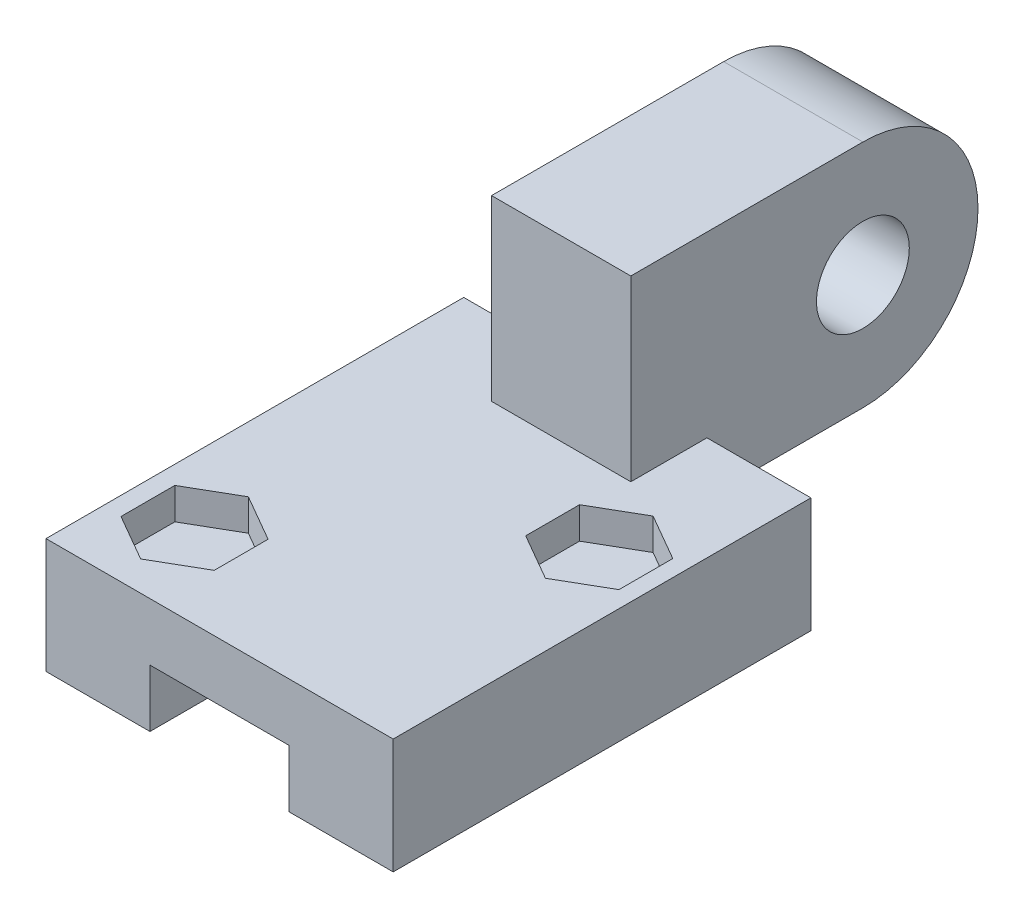
ISO-10303-21;
HEADER;
FILE_DESCRIPTION(('STEP AP214'),'2;1');
FILE_NAME('part.step','',(''),(''),'','','');
FILE_SCHEMA(('AUTOMOTIVE_DESIGN { 1 0 10303 214 1 1 1 1 }'));
ENDSEC;
DATA;
#1=APPLICATION_CONTEXT('core data for automotive mechanical design processes');
#2=APPLICATION_PROTOCOL_DEFINITION('international standard','automotive_design',2000,#1);
#3=PRODUCT_CONTEXT('',#1,'mechanical');
#4=PRODUCT('Part','Part','',(#3));
#5=PRODUCT_RELATED_PRODUCT_CATEGORY('part','',(#4));
#6=PRODUCT_DEFINITION_FORMATION('','',#4);
#7=PRODUCT_DEFINITION_CONTEXT('part definition',#1,'design');
#8=PRODUCT_DEFINITION('design','',#6,#7);
#9=PRODUCT_DEFINITION_SHAPE('','',#8);
#10=(LENGTH_UNIT() NAMED_UNIT(*) SI_UNIT(.MILLI.,.METRE.));
#11=(NAMED_UNIT(*) PLANE_ANGLE_UNIT() SI_UNIT($,.RADIAN.));
#12=(NAMED_UNIT(*) SI_UNIT($,.STERADIAN.) SOLID_ANGLE_UNIT());
#13=UNCERTAINTY_MEASURE_WITH_UNIT(LENGTH_MEASURE(1.E-05),#10,'distance_accuracy_value','');
#14=(GEOMETRIC_REPRESENTATION_CONTEXT(3) GLOBAL_UNCERTAINTY_ASSIGNED_CONTEXT((#13)) GLOBAL_UNIT_ASSIGNED_CONTEXT((#10,
#11,#12)) REPRESENTATION_CONTEXT('',''));
#15=CARTESIAN_POINT('',(0.,0.,0.));
#16=DIRECTION('',(0.,0.,1.));
#17=DIRECTION('',(1.,0.,0.));
#18=AXIS2_PLACEMENT_3D('',#15,#16,#17);
#19=CARTESIAN_POINT('',(-0.935,0.31,-2.25));
#20=DIRECTION('',(0.,1.,0.));
#21=DIRECTION('',(0.,0.,1.));
#22=AXIS2_PLACEMENT_3D('',#19,#20,#21);
#23=PLANE('',#22);
#24=DIRECTION('',(0.866025403784438,0.,0.5));
#25=VECTOR('',#24,1.);
#26=CARTESIAN_POINT('',(-0.836147367097487,0.31,-0.305));
#27=LINE('',#26,#25);
#28=CARTESIAN_POINT('',(-0.836147367097487,0.31,-0.305));
#29=VERTEX_POINT('',#28);
#30=CARTESIAN_POINT('',(-0.585,0.31,-0.159999999999999));
#31=VERTEX_POINT('',#30);
#32=EDGE_CURVE('E272',#29,#31,#27,.T.);
#33=ORIENTED_EDGE('',*,*,#32,.F.);
#34=DIRECTION('',(0.,0.,1.));
#35=VECTOR('',#34,1.);
#36=CARTESIAN_POINT('',(-0.836147367097487,0.31,-0.595));
#37=LINE('',#36,#35);
#38=CARTESIAN_POINT('',(-0.836147367097487,0.31,-0.595));
#39=VERTEX_POINT('',#38);
#40=EDGE_CURVE('E256',#39,#29,#37,.T.);
#41=ORIENTED_EDGE('',*,*,#40,.F.);
#42=DIRECTION('',(-0.866025403784439,0.,0.5));
#43=VECTOR('',#42,1.);
#44=CARTESIAN_POINT('',(-0.585,0.31,-0.74));
#45=LINE('',#44,#43);
#46=CARTESIAN_POINT('',(-0.585,0.31,-0.74));
#47=VERTEX_POINT('',#46);
#48=EDGE_CURVE('E284',#47,#39,#45,.T.);
#49=ORIENTED_EDGE('',*,*,#48,.F.);
#50=DIRECTION('',(-0.866025403784439,0.,-0.5));
#51=VECTOR('',#50,1.);
#52=CARTESIAN_POINT('',(-0.333852632902513,0.31,-0.595));
#53=LINE('',#52,#51);
#54=CARTESIAN_POINT('',(-0.333852632902513,0.31,-0.595));
#55=VERTEX_POINT('',#54);
#56=EDGE_CURVE('E281',#55,#47,#53,.T.);
#57=ORIENTED_EDGE('',*,*,#56,.F.);
#58=DIRECTION('',(0.,0.,-1.));
#59=VECTOR('',#58,1.);
#60=CARTESIAN_POINT('',(-0.333852632902513,0.31,-0.305));
#61=LINE('',#60,#59);
#62=CARTESIAN_POINT('',(-0.333852632902513,0.31,-0.305));
#63=VERTEX_POINT('',#62);
#64=EDGE_CURVE('E278',#63,#55,#61,.T.);
#65=ORIENTED_EDGE('',*,*,#64,.F.);
#66=DIRECTION('',(0.866025403784438,0.,-0.5));
#67=VECTOR('',#66,1.);
#68=CARTESIAN_POINT('',(-0.585,0.31,-0.16));
#69=LINE('',#68,#67);
#70=EDGE_CURVE('E274',#31,#63,#69,.T.);
#71=ORIENTED_EDGE('',*,*,#70,.F.);
#72=EDGE_LOOP('',(#33,#41,#49,#57,#65,#71));
#73=FACE_BOUND('',#72,.T.);
#74=DIRECTION('',(0.866025403784439,0.,0.5));
#75=VECTOR('',#74,1.);
#76=CARTESIAN_POINT('',(0.343852632902512,0.31,-1.305));
#77=LINE('',#76,#75);
#78=CARTESIAN_POINT('',(0.343852632902512,0.31,-1.305));
#79=VERTEX_POINT('',#78);
#80=CARTESIAN_POINT('',(0.594999999999999,0.31,-1.16));
#81=VERTEX_POINT('',#80);
#82=EDGE_CURVE('E275',#79,#81,#77,.T.);
#83=ORIENTED_EDGE('',*,*,#82,.F.);
#84=DIRECTION('',(0.,0.,1.));
#85=VECTOR('',#84,1.);
#86=CARTESIAN_POINT('',(0.343852632902512,0.31,-1.595));
#87=LINE('',#86,#85);
#88=CARTESIAN_POINT('',(0.343852632902512,0.31,-1.595));
#89=VERTEX_POINT('',#88);
#90=EDGE_CURVE('E315',#89,#79,#87,.T.);
#91=ORIENTED_EDGE('',*,*,#90,.F.);
#92=DIRECTION('',(-0.866025403784438,0.,0.5));
#93=VECTOR('',#92,1.);
#94=CARTESIAN_POINT('',(0.595,0.31,-1.74));
#95=LINE('',#94,#93);
#96=CARTESIAN_POINT('',(0.595,0.31,-1.74));
#97=VERTEX_POINT('',#96);
#98=EDGE_CURVE('E318',#97,#89,#95,.T.);
#99=ORIENTED_EDGE('',*,*,#98,.F.);
#100=DIRECTION('',(-0.866025403784438,0.,-0.5));
#101=VECTOR('',#100,1.);
#102=CARTESIAN_POINT('',(0.846147367097487,0.31,-1.595));
#103=LINE('',#102,#101);
#104=CARTESIAN_POINT('',(0.846147367097487,0.31,-1.595));
#105=VERTEX_POINT('',#104);
#106=EDGE_CURVE('E322',#105,#97,#103,.T.);
#107=ORIENTED_EDGE('',*,*,#106,.F.);
#108=DIRECTION('',(0.,0.,-1.));
#109=VECTOR('',#108,1.);
#110=CARTESIAN_POINT('',(0.846147367097487,0.31,-1.305));
#111=LINE('',#110,#109);
#112=CARTESIAN_POINT('',(0.846147367097487,0.31,-1.305));
#113=VERTEX_POINT('',#112);
#114=EDGE_CURVE('E325',#113,#105,#111,.T.);
#115=ORIENTED_EDGE('',*,*,#114,.F.);
#116=DIRECTION('',(0.866025403784439,0.,-0.499999999999999));
#117=VECTOR('',#116,1.);
#118=CARTESIAN_POINT('',(0.594999999999999,0.31,-1.16));
#119=LINE('',#118,#117);
#120=EDGE_CURVE('E328',#81,#113,#119,.T.);
#121=ORIENTED_EDGE('',*,*,#120,.F.);
#122=EDGE_LOOP('',(#83,#91,#99,#107,#115,#121));
#123=FACE_BOUND('',#122,.T.);
#124=DIRECTION('',(-1.,0.,0.));
#125=VECTOR('',#124,1.);
#126=CARTESIAN_POINT('',(-0.935,0.31,-2.25));
#127=LINE('',#126,#125);
#128=CARTESIAN_POINT('',(0.935,0.31,-2.25));
#129=VERTEX_POINT('',#128);
#130=CARTESIAN_POINT('',(0.375,0.31,-2.25));
#131=VERTEX_POINT('',#130);
#132=EDGE_CURVE('E371',#129,#131,#127,.T.);
#133=ORIENTED_EDGE('',*,*,#132,.T.);
#134=DIRECTION('',(0.,0.,1.));
#135=VECTOR('',#134,1.);
#136=CARTESIAN_POINT('',(0.375,0.31,-2.25));
#137=LINE('',#136,#135);
#138=CARTESIAN_POINT('',(0.375,0.31,-1.84));
#139=VERTEX_POINT('',#138);
#140=EDGE_CURVE('E55',#131,#139,#137,.T.);
#141=ORIENTED_EDGE('',*,*,#140,.T.);
#142=DIRECTION('',(-1.,0.,0.));
#143=VECTOR('',#142,1.);
#144=CARTESIAN_POINT('',(-0.935,0.31,-1.84));
#145=LINE('',#144,#143);
#146=CARTESIAN_POINT('',(-0.375,0.31,-1.84));
#147=VERTEX_POINT('',#146);
#148=EDGE_CURVE('E11',#139,#147,#145,.T.);
#149=ORIENTED_EDGE('',*,*,#148,.T.);
#150=DIRECTION('',(0.,0.,1.));
#151=VECTOR('',#150,1.);
#152=CARTESIAN_POINT('',(-0.375,0.31,-2.25));
#153=LINE('',#152,#151);
#154=CARTESIAN_POINT('',(-0.375,0.31,-2.25));
#155=VERTEX_POINT('',#154);
#156=EDGE_CURVE('E225',#155,#147,#153,.T.);
#157=ORIENTED_EDGE('',*,*,#156,.F.);
#158=CARTESIAN_POINT('',(-0.935,0.31,-2.25));
#159=VERTEX_POINT('',#158);
#160=EDGE_CURVE('E370',#155,#159,#127,.T.);
#161=ORIENTED_EDGE('',*,*,#160,.T.);
#162=DIRECTION('',(0.,0.,1.));
#163=VECTOR('',#162,1.);
#164=CARTESIAN_POINT('',(-0.935,0.31,-2.25));
#165=LINE('',#164,#163);
#166=CARTESIAN_POINT('',(-0.935,0.31,0.));
#167=VERTEX_POINT('',#166);
#168=EDGE_CURVE('E396',#159,#167,#165,.T.);
#169=ORIENTED_EDGE('',*,*,#168,.T.);
#170=DIRECTION('',(-1.,0.,0.));
#171=VECTOR('',#170,1.);
#172=CARTESIAN_POINT('',(-0.935,0.31,0.));
#173=LINE('',#172,#171);
#174=CARTESIAN_POINT('',(0.935,0.31,0.));
#175=VERTEX_POINT('',#174);
#176=EDGE_CURVE('E352',#175,#167,#173,.T.);
#177=ORIENTED_EDGE('',*,*,#176,.F.);
#178=DIRECTION('',(0.,0.,1.));
#179=VECTOR('',#178,1.);
#180=CARTESIAN_POINT('',(0.935,0.31,-2.25));
#181=LINE('',#180,#179);
#182=EDGE_CURVE('E399',#129,#175,#181,.T.);
#183=ORIENTED_EDGE('',*,*,#182,.F.);
#184=EDGE_LOOP('',(#133,#141,#149,#157,#161,#169,#177,#183));
#185=FACE_BOUND('',#184,.T.);
#186=ADVANCED_FACE('F37',(#73,#123,#185),#23,.T.);
#187=CARTESIAN_POINT('',(0.,0.,-2.25));
#188=DIRECTION('',(0.,0.,1.));
#189=DIRECTION('',(1.,0.,0.));
#190=AXIS2_PLACEMENT_3D('',#187,#188,#189);
#191=PLANE('',#190);
#192=DIRECTION('',(0.,-1.,0.));
#193=VECTOR('',#192,1.);
#194=CARTESIAN_POINT('',(0.375,0.,-2.25));
#195=LINE('',#194,#193);
#196=CARTESIAN_POINT('',(0.375,0.0299999999999999,-2.25));
#197=VERTEX_POINT('',#196);
#198=EDGE_CURVE('E45',#131,#197,#195,.T.);
#199=ORIENTED_EDGE('',*,*,#198,.F.);
#200=ORIENTED_EDGE('',*,*,#132,.F.);
#201=DIRECTION('',(0.,1.,0.));
#202=VECTOR('',#201,1.);
#203=CARTESIAN_POINT('',(0.935,0.31,-2.25));
#204=LINE('',#203,#202);
#205=CARTESIAN_POINT('',(0.935,-0.31,-2.25));
#206=VERTEX_POINT('',#205);
#207=EDGE_CURVE('E367',#206,#129,#204,.T.);
#208=ORIENTED_EDGE('',*,*,#207,.F.);
#209=DIRECTION('',(1.,0.,0.));
#210=VECTOR('',#209,1.);
#211=CARTESIAN_POINT('',(0.375,-0.31,-2.25));
#212=LINE('',#211,#210);
#213=CARTESIAN_POINT('',(0.375,-0.31,-2.25));
#214=VERTEX_POINT('',#213);
#215=EDGE_CURVE('E364',#214,#206,#212,.T.);
#216=ORIENTED_EDGE('',*,*,#215,.F.);
#217=DIRECTION('',(0.,-1.,0.));
#218=VECTOR('',#217,1.);
#219=CARTESIAN_POINT('',(0.375,-0.31,-2.25));
#220=LINE('',#219,#218);
#221=CARTESIAN_POINT('',(0.375,0.,-2.25));
#222=VERTEX_POINT('',#221);
#223=EDGE_CURVE('E361',#222,#214,#220,.T.);
#224=ORIENTED_EDGE('',*,*,#223,.F.);
#225=DIRECTION('',(1.,0.,0.));
#226=VECTOR('',#225,1.);
#227=CARTESIAN_POINT('',(-0.375,0.,-2.25));
#228=LINE('',#227,#226);
#229=CARTESIAN_POINT('',(-0.375,0.,-2.25));
#230=VERTEX_POINT('',#229);
#231=EDGE_CURVE('E358',#230,#222,#228,.T.);
#232=ORIENTED_EDGE('',*,*,#231,.F.);
#233=DIRECTION('',(0.,1.,0.));
#234=VECTOR('',#233,1.);
#235=CARTESIAN_POINT('',(-0.375,-0.31,-2.25));
#236=LINE('',#235,#234);
#237=CARTESIAN_POINT('',(-0.375,-0.31,-2.25));
#238=VERTEX_POINT('',#237);
#239=EDGE_CURVE('E355',#238,#230,#236,.T.);
#240=ORIENTED_EDGE('',*,*,#239,.F.);
#241=DIRECTION('',(1.,0.,0.));
#242=VECTOR('',#241,1.);
#243=CARTESIAN_POINT('',(-0.935,-0.31,-2.25));
#244=LINE('',#243,#242);
#245=CARTESIAN_POINT('',(-0.935,-0.31,-2.25));
#246=VERTEX_POINT('',#245);
#247=EDGE_CURVE('E351',#246,#238,#244,.T.);
#248=ORIENTED_EDGE('',*,*,#247,.F.);
#249=DIRECTION('',(0.,-1.,0.));
#250=VECTOR('',#249,1.);
#251=CARTESIAN_POINT('',(-0.935,0.31,-2.25));
#252=LINE('',#251,#250);
#253=EDGE_CURVE('E348',#159,#246,#252,.T.);
#254=ORIENTED_EDGE('',*,*,#253,.F.);
#255=ORIENTED_EDGE('',*,*,#160,.F.);
#256=DIRECTION('',(0.,-1.,0.));
#257=VECTOR('',#256,1.);
#258=CARTESIAN_POINT('',(-0.375,0.,-2.25));
#259=LINE('',#258,#257);
#260=CARTESIAN_POINT('',(-0.375,0.0299999999999999,-2.25));
#261=VERTEX_POINT('',#260);
#262=EDGE_CURVE('E413',#155,#261,#259,.T.);
#263=ORIENTED_EDGE('',*,*,#262,.T.);
#264=DIRECTION('',(-1.,0.,0.));
#265=VECTOR('',#264,1.);
#266=CARTESIAN_POINT('',(0.,0.0299999999999999,-2.25));
#267=LINE('',#266,#265);
#268=EDGE_CURVE('E398',#197,#261,#267,.T.);
#269=ORIENTED_EDGE('',*,*,#268,.F.);
#270=EDGE_LOOP('',(#199,#200,#208,#216,#224,#232,#240,#248,#254,#255,#263,#269));
#271=FACE_BOUND('',#270,.T.);
#272=ADVANCED_FACE('F417',(#271),#191,.F.);
#273=CARTESIAN_POINT('',(-0.935,0.31,-2.25));
#274=DIRECTION('',(-1.,0.,0.));
#275=DIRECTION('',(0.,0.,1.));
#276=AXIS2_PLACEMENT_3D('',#273,#274,#275);
#277=PLANE('',#276);
#278=DIRECTION('',(0.,-1.,0.));
#279=VECTOR('',#278,1.);
#280=CARTESIAN_POINT('',(-0.935,0.31,0.));
#281=LINE('',#280,#279);
#282=CARTESIAN_POINT('',(-0.935,-0.31,0.));
#283=VERTEX_POINT('',#282);
#284=EDGE_CURVE('E291',#167,#283,#281,.T.);
#285=ORIENTED_EDGE('',*,*,#284,.F.);
#286=ORIENTED_EDGE('',*,*,#168,.F.);
#287=ORIENTED_EDGE('',*,*,#253,.T.);
#288=DIRECTION('',(0.,0.,1.));
#289=VECTOR('',#288,1.);
#290=CARTESIAN_POINT('',(-0.935,-0.31,-2.25));
#291=LINE('',#290,#289);
#292=EDGE_CURVE('E373',#246,#283,#291,.T.);
#293=ORIENTED_EDGE('',*,*,#292,.T.);
#294=EDGE_LOOP('',(#285,#286,#287,#293));
#295=FACE_BOUND('',#294,.T.);
#296=ADVANCED_FACE('F39',(#295),#277,.T.);
#297=CARTESIAN_POINT('',(0.935,0.31,-2.25));
#298=DIRECTION('',(1.,0.,0.));
#299=DIRECTION('',(0.,0.,-1.));
#300=AXIS2_PLACEMENT_3D('',#297,#298,#299);
#301=PLANE('',#300);
#302=DIRECTION('',(0.,1.,0.));
#303=VECTOR('',#302,1.);
#304=CARTESIAN_POINT('',(0.935,0.31,0.));
#305=LINE('',#304,#303);
#306=CARTESIAN_POINT('',(0.935,-0.31,0.));
#307=VERTEX_POINT('',#306);
#308=EDGE_CURVE('E391',#307,#175,#305,.T.);
#309=ORIENTED_EDGE('',*,*,#308,.F.);
#310=DIRECTION('',(0.,0.,1.));
#311=VECTOR('',#310,1.);
#312=CARTESIAN_POINT('',(0.935,-0.31,-2.25));
#313=LINE('',#312,#311);
#314=EDGE_CURVE('E401',#206,#307,#313,.T.);
#315=ORIENTED_EDGE('',*,*,#314,.F.);
#316=ORIENTED_EDGE('',*,*,#207,.T.);
#317=ORIENTED_EDGE('',*,*,#182,.T.);
#318=EDGE_LOOP('',(#309,#315,#316,#317));
#319=FACE_BOUND('',#318,.T.);
#320=ADVANCED_FACE('F462',(#319),#301,.T.);
#321=CARTESIAN_POINT('',(0.375,-0.31,-2.25));
#322=DIRECTION('',(0.,-1.,0.));
#323=DIRECTION('',(0.,0.,-1.));
#324=AXIS2_PLACEMENT_3D('',#321,#322,#323);
#325=PLANE('',#324);
#326=DIRECTION('',(1.,0.,0.));
#327=VECTOR('',#326,1.);
#328=CARTESIAN_POINT('',(0.375,-0.31,0.));
#329=LINE('',#328,#327);
#330=CARTESIAN_POINT('',(0.375,-0.31,0.));
#331=VERTEX_POINT('',#330);
#332=EDGE_CURVE('E388',#331,#307,#329,.T.);
#333=ORIENTED_EDGE('',*,*,#332,.F.);
#334=DIRECTION('',(0.,0.,1.));
#335=VECTOR('',#334,1.);
#336=CARTESIAN_POINT('',(0.375,-0.31,-2.25));
#337=LINE('',#336,#335);
#338=EDGE_CURVE('E403',#214,#331,#337,.T.);
#339=ORIENTED_EDGE('',*,*,#338,.F.);
#340=ORIENTED_EDGE('',*,*,#215,.T.);
#341=ORIENTED_EDGE('',*,*,#314,.T.);
#342=EDGE_LOOP('',(#333,#339,#340,#341));
#343=FACE_BOUND('',#342,.T.);
#344=ADVANCED_FACE('F465',(#343),#325,.T.);
#345=CARTESIAN_POINT('',(0.375,-0.31,-2.25));
#346=DIRECTION('',(-1.,0.,0.));
#347=DIRECTION('',(0.,0.,1.));
#348=AXIS2_PLACEMENT_3D('',#345,#346,#347);
#349=PLANE('',#348);
#350=DIRECTION('',(0.,-1.,0.));
#351=VECTOR('',#350,1.);
#352=CARTESIAN_POINT('',(0.375,-0.31,0.));
#353=LINE('',#352,#351);
#354=CARTESIAN_POINT('',(0.375,0.,0.));
#355=VERTEX_POINT('',#354);
#356=EDGE_CURVE('E385',#355,#331,#353,.T.);
#357=ORIENTED_EDGE('',*,*,#356,.F.);
#358=DIRECTION('',(0.,0.,1.));
#359=VECTOR('',#358,1.);
#360=CARTESIAN_POINT('',(0.375,0.,-2.25));
#361=LINE('',#360,#359);
#362=EDGE_CURVE('E405',#222,#355,#361,.T.);
#363=ORIENTED_EDGE('',*,*,#362,.F.);
#364=ORIENTED_EDGE('',*,*,#223,.T.);
#365=ORIENTED_EDGE('',*,*,#338,.T.);
#366=EDGE_LOOP('',(#357,#363,#364,#365));
#367=FACE_BOUND('',#366,.T.);
#368=ADVANCED_FACE('F469',(#367),#349,.T.);
#369=CARTESIAN_POINT('',(-0.375,0.,-2.25));
#370=DIRECTION('',(0.,-1.,0.));
#371=DIRECTION('',(0.,0.,-1.));
#372=AXIS2_PLACEMENT_3D('',#369,#370,#371);
#373=PLANE('',#372);
#374=DIRECTION('',(1.,0.,0.));
#375=VECTOR('',#374,1.);
#376=CARTESIAN_POINT('',(-0.375,0.,0.));
#377=LINE('',#376,#375);
#378=CARTESIAN_POINT('',(-0.375,0.,0.));
#379=VERTEX_POINT('',#378);
#380=EDGE_CURVE('E382',#379,#355,#377,.T.);
#381=ORIENTED_EDGE('',*,*,#380,.F.);
#382=DIRECTION('',(0.,0.,1.));
#383=VECTOR('',#382,1.);
#384=CARTESIAN_POINT('',(-0.375,0.,-2.25));
#385=LINE('',#384,#383);
#386=EDGE_CURVE('E407',#230,#379,#385,.T.);
#387=ORIENTED_EDGE('',*,*,#386,.F.);
#388=ORIENTED_EDGE('',*,*,#231,.T.);
#389=ORIENTED_EDGE('',*,*,#362,.T.);
#390=EDGE_LOOP('',(#381,#387,#388,#389));
#391=FACE_BOUND('',#390,.T.);
#392=ADVANCED_FACE('F473',(#391),#373,.T.);
#393=CARTESIAN_POINT('',(-0.375,-0.31,-2.25));
#394=DIRECTION('',(1.,0.,0.));
#395=DIRECTION('',(0.,0.,-1.));
#396=AXIS2_PLACEMENT_3D('',#393,#394,#395);
#397=PLANE('',#396);
#398=DIRECTION('',(0.,1.,0.));
#399=VECTOR('',#398,1.);
#400=CARTESIAN_POINT('',(-0.375,-0.31,0.));
#401=LINE('',#400,#399);
#402=CARTESIAN_POINT('',(-0.375,-0.31,0.));
#403=VERTEX_POINT('',#402);
#404=EDGE_CURVE('E379',#403,#379,#401,.T.);
#405=ORIENTED_EDGE('',*,*,#404,.F.);
#406=DIRECTION('',(0.,0.,1.));
#407=VECTOR('',#406,1.);
#408=CARTESIAN_POINT('',(-0.375,-0.31,-2.25));
#409=LINE('',#408,#407);
#410=EDGE_CURVE('E409',#238,#403,#409,.T.);
#411=ORIENTED_EDGE('',*,*,#410,.F.);
#412=ORIENTED_EDGE('',*,*,#239,.T.);
#413=ORIENTED_EDGE('',*,*,#386,.T.);
#414=EDGE_LOOP('',(#405,#411,#412,#413));
#415=FACE_BOUND('',#414,.T.);
#416=ADVANCED_FACE('F477',(#415),#397,.T.);
#417=CARTESIAN_POINT('',(-0.935,-0.31,-2.25));
#418=DIRECTION('',(0.,-1.,0.));
#419=DIRECTION('',(0.,0.,-1.));
#420=AXIS2_PLACEMENT_3D('',#417,#418,#419);
#421=PLANE('',#420);
#422=DIRECTION('',(1.,0.,0.));
#423=VECTOR('',#422,1.);
#424=CARTESIAN_POINT('',(-0.935,-0.31,0.));
#425=LINE('',#424,#423);
#426=EDGE_CURVE('E376',#283,#403,#425,.T.);
#427=ORIENTED_EDGE('',*,*,#426,.F.);
#428=ORIENTED_EDGE('',*,*,#292,.F.);
#429=ORIENTED_EDGE('',*,*,#247,.T.);
#430=ORIENTED_EDGE('',*,*,#410,.T.);
#431=EDGE_LOOP('',(#427,#428,#429,#430));
#432=FACE_BOUND('',#431,.T.);
#433=ADVANCED_FACE('F480',(#432),#421,.T.);
#434=CARTESIAN_POINT('',(0.,0.,0.));
#435=DIRECTION('',(0.,0.,1.));
#436=DIRECTION('',(1.,0.,0.));
#437=AXIS2_PLACEMENT_3D('',#434,#435,#436);
#438=PLANE('',#437);
#439=ORIENTED_EDGE('',*,*,#284,.T.);
#440=ORIENTED_EDGE('',*,*,#426,.T.);
#441=ORIENTED_EDGE('',*,*,#404,.T.);
#442=ORIENTED_EDGE('',*,*,#380,.T.);
#443=ORIENTED_EDGE('',*,*,#356,.T.);
#444=ORIENTED_EDGE('',*,*,#332,.T.);
#445=ORIENTED_EDGE('',*,*,#308,.T.);
#446=ORIENTED_EDGE('',*,*,#176,.T.);
#447=EDGE_LOOP('',(#439,#440,#441,#442,#443,#444,#445,#446));
#448=FACE_BOUND('',#447,.T.);
#449=ADVANCED_FACE('F461',(#448),#438,.T.);
#450=CARTESIAN_POINT('',(0.343852632902512,0.14,-1.305));
#451=DIRECTION('',(-0.5,0.,0.866025403784439));
#452=DIRECTION('',(0.866025403784439,0.,0.5));
#453=AXIS2_PLACEMENT_3D('',#450,#451,#452);
#454=PLANE('',#453);
#455=ORIENTED_EDGE('',*,*,#82,.T.);
#456=DIRECTION('',(0.,1.,0.));
#457=VECTOR('',#456,1.);
#458=CARTESIAN_POINT('',(0.594999999999999,0.14,-1.16));
#459=LINE('',#458,#457);
#460=CARTESIAN_POINT('',(0.594999999999999,0.14,-1.16));
#461=VERTEX_POINT('',#460);
#462=EDGE_CURVE('E302',#461,#81,#459,.T.);
#463=ORIENTED_EDGE('',*,*,#462,.F.);
#464=DIRECTION('',(0.866025403784439,0.,0.5));
#465=VECTOR('',#464,1.);
#466=CARTESIAN_POINT('',(0.343852632902512,0.14,-1.305));
#467=LINE('',#466,#465);
#468=CARTESIAN_POINT('',(0.343852632902512,0.14,-1.305));
#469=VERTEX_POINT('',#468);
#470=EDGE_CURVE('E319',#469,#461,#467,.T.);
#471=ORIENTED_EDGE('',*,*,#470,.F.);
#472=DIRECTION('',(0.,1.,0.));
#473=VECTOR('',#472,1.);
#474=CARTESIAN_POINT('',(0.343852632902512,0.14,-1.305));
#475=LINE('',#474,#473);
#476=EDGE_CURVE('E251',#469,#79,#475,.T.);
#477=ORIENTED_EDGE('',*,*,#476,.T.);
#478=EDGE_LOOP('',(#455,#463,#471,#477));
#479=FACE_BOUND('',#478,.T.);
#480=ADVANCED_FACE('F487',(#479),#454,.F.);
#481=CARTESIAN_POINT('',(0.343852632902512,0.14,-1.595));
#482=DIRECTION('',(-1.,0.,0.));
#483=DIRECTION('',(0.,0.,1.));
#484=AXIS2_PLACEMENT_3D('',#481,#482,#483);
#485=PLANE('',#484);
#486=ORIENTED_EDGE('',*,*,#90,.T.);
#487=ORIENTED_EDGE('',*,*,#476,.F.);
#488=DIRECTION('',(0.,0.,1.));
#489=VECTOR('',#488,1.);
#490=CARTESIAN_POINT('',(0.343852632902512,0.14,-1.595));
#491=LINE('',#490,#489);
#492=CARTESIAN_POINT('',(0.343852632902512,0.14,-1.595));
#493=VERTEX_POINT('',#492);
#494=EDGE_CURVE('E305',#493,#469,#491,.T.);
#495=ORIENTED_EDGE('',*,*,#494,.F.);
#496=DIRECTION('',(0.,1.,0.));
#497=VECTOR('',#496,1.);
#498=CARTESIAN_POINT('',(0.343852632902512,0.14,-1.595));
#499=LINE('',#498,#497);
#500=EDGE_CURVE('E312',#493,#89,#499,.T.);
#501=ORIENTED_EDGE('',*,*,#500,.T.);
#502=EDGE_LOOP('',(#486,#487,#495,#501));
#503=FACE_BOUND('',#502,.T.);
#504=ADVANCED_FACE('F541',(#503),#485,.F.);
#505=CARTESIAN_POINT('',(0.595,0.14,-1.74));
#506=DIRECTION('',(-0.5,0.,-0.866025403784438));
#507=DIRECTION('',(-0.866025403784438,0.,0.5));
#508=AXIS2_PLACEMENT_3D('',#505,#506,#507);
#509=PLANE('',#508);
#510=ORIENTED_EDGE('',*,*,#98,.T.);
#511=ORIENTED_EDGE('',*,*,#500,.F.);
#512=DIRECTION('',(-0.866025403784438,0.,0.5));
#513=VECTOR('',#512,1.);
#514=CARTESIAN_POINT('',(0.595,0.14,-1.74));
#515=LINE('',#514,#513);
#516=CARTESIAN_POINT('',(0.595,0.14,-1.74));
#517=VERTEX_POINT('',#516);
#518=EDGE_CURVE('E334',#517,#493,#515,.T.);
#519=ORIENTED_EDGE('',*,*,#518,.F.);
#520=DIRECTION('',(0.,1.,0.));
#521=VECTOR('',#520,1.);
#522=CARTESIAN_POINT('',(0.595,0.14,-1.74));
#523=LINE('',#522,#521);
#524=EDGE_CURVE('E310',#517,#97,#523,.T.);
#525=ORIENTED_EDGE('',*,*,#524,.T.);
#526=EDGE_LOOP('',(#510,#511,#519,#525));
#527=FACE_BOUND('',#526,.T.);
#528=ADVANCED_FACE('F554',(#527),#509,.F.);
#529=CARTESIAN_POINT('',(0.846147367097487,0.14,-1.595));
#530=DIRECTION('',(0.5,0.,-0.866025403784439));
#531=DIRECTION('',(-0.866025403784439,0.,-0.5));
#532=AXIS2_PLACEMENT_3D('',#529,#530,#531);
#533=PLANE('',#532);
#534=ORIENTED_EDGE('',*,*,#106,.T.);
#535=ORIENTED_EDGE('',*,*,#524,.F.);
#536=DIRECTION('',(-0.866025403784438,0.,-0.5));
#537=VECTOR('',#536,1.);
#538=CARTESIAN_POINT('',(0.846147367097487,0.14,-1.595));
#539=LINE('',#538,#537);
#540=CARTESIAN_POINT('',(0.846147367097487,0.14,-1.595));
#541=VERTEX_POINT('',#540);
#542=EDGE_CURVE('E337',#541,#517,#539,.T.);
#543=ORIENTED_EDGE('',*,*,#542,.F.);
#544=DIRECTION('',(0.,1.,0.));
#545=VECTOR('',#544,1.);
#546=CARTESIAN_POINT('',(0.846147367097487,0.14,-1.595));
#547=LINE('',#546,#545);
#548=EDGE_CURVE('E308',#541,#105,#547,.T.);
#549=ORIENTED_EDGE('',*,*,#548,.T.);
#550=EDGE_LOOP('',(#534,#535,#543,#549));
#551=FACE_BOUND('',#550,.T.);
#552=ADVANCED_FACE('F550',(#551),#533,.F.);
#553=CARTESIAN_POINT('',(0.846147367097487,0.14,-1.305));
#554=DIRECTION('',(1.,0.,0.));
#555=DIRECTION('',(0.,0.,-1.));
#556=AXIS2_PLACEMENT_3D('',#553,#554,#555);
#557=PLANE('',#556);
#558=ORIENTED_EDGE('',*,*,#114,.T.);
#559=ORIENTED_EDGE('',*,*,#548,.F.);
#560=DIRECTION('',(0.,0.,-1.));
#561=VECTOR('',#560,1.);
#562=CARTESIAN_POINT('',(0.846147367097487,0.14,-1.305));
#563=LINE('',#562,#561);
#564=CARTESIAN_POINT('',(0.846147367097487,0.14,-1.305));
#565=VERTEX_POINT('',#564);
#566=EDGE_CURVE('E340',#565,#541,#563,.T.);
#567=ORIENTED_EDGE('',*,*,#566,.F.);
#568=DIRECTION('',(0.,1.,0.));
#569=VECTOR('',#568,1.);
#570=CARTESIAN_POINT('',(0.846147367097487,0.14,-1.305));
#571=LINE('',#570,#569);
#572=EDGE_CURVE('E306',#565,#113,#571,.T.);
#573=ORIENTED_EDGE('',*,*,#572,.T.);
#574=EDGE_LOOP('',(#558,#559,#567,#573));
#575=FACE_BOUND('',#574,.T.);
#576=ADVANCED_FACE('F546',(#575),#557,.F.);
#577=CARTESIAN_POINT('',(0.594999999999999,0.14,-1.16));
#578=DIRECTION('',(0.499999999999999,0.,0.866025403784439));
#579=DIRECTION('',(0.866025403784439,0.,-0.499999999999999));
#580=AXIS2_PLACEMENT_3D('',#577,#578,#579);
#581=PLANE('',#580);
#582=ORIENTED_EDGE('',*,*,#120,.T.);
#583=ORIENTED_EDGE('',*,*,#572,.F.);
#584=DIRECTION('',(0.866025403784439,0.,-0.499999999999999));
#585=VECTOR('',#584,1.);
#586=CARTESIAN_POINT('',(0.594999999999999,0.14,-1.16));
#587=LINE('',#586,#585);
#588=EDGE_CURVE('E343',#461,#565,#587,.T.);
#589=ORIENTED_EDGE('',*,*,#588,.F.);
#590=ORIENTED_EDGE('',*,*,#462,.T.);
#591=EDGE_LOOP('',(#582,#583,#589,#590));
#592=FACE_BOUND('',#591,.T.);
#593=ADVANCED_FACE('F543',(#592),#581,.F.);
#594=CARTESIAN_POINT('',(0.,0.14,0.));
#595=DIRECTION('',(0.,1.,0.));
#596=DIRECTION('',(0.,0.,1.));
#597=AXIS2_PLACEMENT_3D('',#594,#595,#596);
#598=PLANE('',#597);
#599=ORIENTED_EDGE('',*,*,#470,.T.);
#600=ORIENTED_EDGE('',*,*,#588,.T.);
#601=ORIENTED_EDGE('',*,*,#566,.T.);
#602=ORIENTED_EDGE('',*,*,#542,.T.);
#603=ORIENTED_EDGE('',*,*,#518,.T.);
#604=ORIENTED_EDGE('',*,*,#494,.T.);
#605=EDGE_LOOP('',(#599,#600,#601,#602,#603,#604));
#606=FACE_BOUND('',#605,.T.);
#607=ADVANCED_FACE('F537',(#606),#598,.T.);
#608=CARTESIAN_POINT('',(-0.836147367097487,0.14,-0.305));
#609=DIRECTION('',(-0.5,0.,0.866025403784439));
#610=DIRECTION('',(0.866025403784439,0.,0.5));
#611=AXIS2_PLACEMENT_3D('',#608,#609,#610);
#612=PLANE('',#611);
#613=ORIENTED_EDGE('',*,*,#32,.T.);
#614=DIRECTION('',(0.,1.,0.));
#615=VECTOR('',#614,1.);
#616=CARTESIAN_POINT('',(-0.585,0.14,-0.16));
#617=LINE('',#616,#615);
#618=CARTESIAN_POINT('',(-0.585,0.14,-0.16));
#619=VERTEX_POINT('',#618);
#620=EDGE_CURVE('E271',#619,#31,#617,.T.);
#621=ORIENTED_EDGE('',*,*,#620,.F.);
#622=DIRECTION('',(0.866025403784438,0.,0.5));
#623=VECTOR('',#622,1.);
#624=CARTESIAN_POINT('',(-0.836147367097487,0.14,-0.305));
#625=LINE('',#624,#623);
#626=CARTESIAN_POINT('',(-0.836147367097487,0.14,-0.305));
#627=VERTEX_POINT('',#626);
#628=EDGE_CURVE('E252',#627,#619,#625,.T.);
#629=ORIENTED_EDGE('',*,*,#628,.F.);
#630=DIRECTION('',(0.,1.,0.));
#631=VECTOR('',#630,1.);
#632=CARTESIAN_POINT('',(-0.836147367097487,0.14,-0.305));
#633=LINE('',#632,#631);
#634=EDGE_CURVE('E289',#627,#29,#633,.T.);
#635=ORIENTED_EDGE('',*,*,#634,.T.);
#636=EDGE_LOOP('',(#613,#621,#629,#635));
#637=FACE_BOUND('',#636,.T.);
#638=ADVANCED_FACE('F519',(#637),#612,.F.);
#639=CARTESIAN_POINT('',(-0.836147367097487,0.14,-0.595));
#640=DIRECTION('',(-1.,0.,0.));
#641=DIRECTION('',(0.,0.,1.));
#642=AXIS2_PLACEMENT_3D('',#639,#640,#641);
#643=PLANE('',#642);
#644=ORIENTED_EDGE('',*,*,#40,.T.);
#645=ORIENTED_EDGE('',*,*,#634,.F.);
#646=DIRECTION('',(0.,0.,1.));
#647=VECTOR('',#646,1.);
#648=CARTESIAN_POINT('',(-0.836147367097487,0.14,-0.595));
#649=LINE('',#648,#647);
#650=CARTESIAN_POINT('',(-0.836147367097487,0.14,-0.595));
#651=VERTEX_POINT('',#650);
#652=EDGE_CURVE('E268',#651,#627,#649,.T.);
#653=ORIENTED_EDGE('',*,*,#652,.F.);
#654=DIRECTION('',(0.,1.,0.));
#655=VECTOR('',#654,1.);
#656=CARTESIAN_POINT('',(-0.836147367097487,0.14,-0.595));
#657=LINE('',#656,#655);
#658=EDGE_CURVE('E292',#651,#39,#657,.T.);
#659=ORIENTED_EDGE('',*,*,#658,.T.);
#660=EDGE_LOOP('',(#644,#645,#653,#659));
#661=FACE_BOUND('',#660,.T.);
#662=ADVANCED_FACE('F515',(#661),#643,.F.);
#663=CARTESIAN_POINT('',(-0.585,0.14,-0.74));
#664=DIRECTION('',(-0.5,0.,-0.866025403784439));
#665=DIRECTION('',(-0.866025403784439,0.,0.5));
#666=AXIS2_PLACEMENT_3D('',#663,#664,#665);
#667=PLANE('',#666);
#668=ORIENTED_EDGE('',*,*,#48,.T.);
#669=ORIENTED_EDGE('',*,*,#658,.F.);
#670=DIRECTION('',(-0.866025403784439,0.,0.5));
#671=VECTOR('',#670,1.);
#672=CARTESIAN_POINT('',(-0.585,0.14,-0.74));
#673=LINE('',#672,#671);
#674=CARTESIAN_POINT('',(-0.585,0.14,-0.74));
#675=VERTEX_POINT('',#674);
#676=EDGE_CURVE('E265',#675,#651,#673,.T.);
#677=ORIENTED_EDGE('',*,*,#676,.F.);
#678=DIRECTION('',(0.,1.,0.));
#679=VECTOR('',#678,1.);
#680=CARTESIAN_POINT('',(-0.585,0.14,-0.74));
#681=LINE('',#680,#679);
#682=EDGE_CURVE('E294',#675,#47,#681,.T.);
#683=ORIENTED_EDGE('',*,*,#682,.T.);
#684=EDGE_LOOP('',(#668,#669,#677,#683));
#685=FACE_BOUND('',#684,.T.);
#686=ADVANCED_FACE('F518',(#685),#667,.F.);
#687=CARTESIAN_POINT('',(-0.333852632902513,0.14,-0.595));
#688=DIRECTION('',(0.5,0.,-0.866025403784439));
#689=DIRECTION('',(-0.866025403784439,0.,-0.5));
#690=AXIS2_PLACEMENT_3D('',#687,#688,#689);
#691=PLANE('',#690);
#692=ORIENTED_EDGE('',*,*,#56,.T.);
#693=ORIENTED_EDGE('',*,*,#682,.F.);
#694=DIRECTION('',(-0.866025403784439,0.,-0.5));
#695=VECTOR('',#694,1.);
#696=CARTESIAN_POINT('',(-0.333852632902513,0.14,-0.595));
#697=LINE('',#696,#695);
#698=CARTESIAN_POINT('',(-0.333852632902513,0.14,-0.595));
#699=VERTEX_POINT('',#698);
#700=EDGE_CURVE('E262',#699,#675,#697,.T.);
#701=ORIENTED_EDGE('',*,*,#700,.F.);
#702=DIRECTION('',(0.,1.,0.));
#703=VECTOR('',#702,1.);
#704=CARTESIAN_POINT('',(-0.333852632902513,0.14,-0.595));
#705=LINE('',#704,#703);
#706=EDGE_CURVE('E296',#699,#55,#705,.T.);
#707=ORIENTED_EDGE('',*,*,#706,.T.);
#708=EDGE_LOOP('',(#692,#693,#701,#707));
#709=FACE_BOUND('',#708,.T.);
#710=ADVANCED_FACE('F523',(#709),#691,.F.);
#711=CARTESIAN_POINT('',(-0.333852632902513,0.14,-0.305));
#712=DIRECTION('',(1.,0.,0.));
#713=DIRECTION('',(0.,0.,-1.));
#714=AXIS2_PLACEMENT_3D('',#711,#712,#713);
#715=PLANE('',#714);
#716=ORIENTED_EDGE('',*,*,#64,.T.);
#717=ORIENTED_EDGE('',*,*,#706,.F.);
#718=DIRECTION('',(0.,0.,-1.));
#719=VECTOR('',#718,1.);
#720=CARTESIAN_POINT('',(-0.333852632902513,0.14,-0.305));
#721=LINE('',#720,#719);
#722=CARTESIAN_POINT('',(-0.333852632902513,0.14,-0.305));
#723=VERTEX_POINT('',#722);
#724=EDGE_CURVE('E259',#723,#699,#721,.T.);
#725=ORIENTED_EDGE('',*,*,#724,.F.);
#726=DIRECTION('',(0.,1.,0.));
#727=VECTOR('',#726,1.);
#728=CARTESIAN_POINT('',(-0.333852632902513,0.14,-0.305));
#729=LINE('',#728,#727);
#730=EDGE_CURVE('E298',#723,#63,#729,.T.);
#731=ORIENTED_EDGE('',*,*,#730,.T.);
#732=EDGE_LOOP('',(#716,#717,#725,#731));
#733=FACE_BOUND('',#732,.T.);
#734=ADVANCED_FACE('F527',(#733),#715,.F.);
#735=CARTESIAN_POINT('',(-0.585,0.14,-0.16));
#736=DIRECTION('',(0.5,0.,0.866025403784439));
#737=DIRECTION('',(0.866025403784439,0.,-0.5));
#738=AXIS2_PLACEMENT_3D('',#735,#736,#737);
#739=PLANE('',#738);
#740=ORIENTED_EDGE('',*,*,#70,.T.);
#741=ORIENTED_EDGE('',*,*,#730,.F.);
#742=DIRECTION('',(0.866025403784438,0.,-0.5));
#743=VECTOR('',#742,1.);
#744=CARTESIAN_POINT('',(-0.585,0.14,-0.16));
#745=LINE('',#744,#743);
#746=EDGE_CURVE('E255',#619,#723,#745,.T.);
#747=ORIENTED_EDGE('',*,*,#746,.F.);
#748=ORIENTED_EDGE('',*,*,#620,.T.);
#749=EDGE_LOOP('',(#740,#741,#747,#748));
#750=FACE_BOUND('',#749,.T.);
#751=ADVANCED_FACE('F513',(#750),#739,.F.);
#752=CARTESIAN_POINT('',(0.,0.14,0.));
#753=DIRECTION('',(0.,1.,0.));
#754=DIRECTION('',(0.,0.,1.));
#755=AXIS2_PLACEMENT_3D('',#752,#753,#754);
#756=PLANE('',#755);
#757=ORIENTED_EDGE('',*,*,#628,.T.);
#758=ORIENTED_EDGE('',*,*,#746,.T.);
#759=ORIENTED_EDGE('',*,*,#724,.T.);
#760=ORIENTED_EDGE('',*,*,#700,.T.);
#761=ORIENTED_EDGE('',*,*,#676,.T.);
#762=ORIENTED_EDGE('',*,*,#652,.T.);
#763=EDGE_LOOP('',(#757,#758,#759,#760,#761,#762));
#764=FACE_BOUND('',#763,.T.);
#765=ADVANCED_FACE('F447',(#764),#756,.T.);
#766=CARTESIAN_POINT('',(0.375,0.0299999999999999,-1.84));
#767=DIRECTION('',(0.,1.,0.));
#768=DIRECTION('',(0.,0.,1.));
#769=AXIS2_PLACEMENT_3D('',#766,#767,#768);
#770=PLANE('',#769);
#771=DIRECTION('',(0.,0.,-1.));
#772=VECTOR('',#771,1.);
#773=CARTESIAN_POINT('',(0.375,0.0299999999999999,-1.84));
#774=LINE('',#773,#772);
#775=CARTESIAN_POINT('',(0.375,0.0299999999999999,-3.09));
#776=VERTEX_POINT('',#775);
#777=EDGE_CURVE('E207',#197,#776,#774,.T.);
#778=ORIENTED_EDGE('',*,*,#777,.F.);
#779=ORIENTED_EDGE('',*,*,#268,.T.);
#780=DIRECTION('',(0.,0.,-1.));
#781=VECTOR('',#780,1.);
#782=CARTESIAN_POINT('',(-0.375,0.0299999999999999,-1.84));
#783=LINE('',#782,#781);
#784=CARTESIAN_POINT('',(-0.375,0.0299999999999999,-3.09));
#785=VERTEX_POINT('',#784);
#786=EDGE_CURVE('E222',#261,#785,#783,.T.);
#787=ORIENTED_EDGE('',*,*,#786,.T.);
#788=DIRECTION('',(-1.,0.,0.));
#789=VECTOR('',#788,1.);
#790=CARTESIAN_POINT('',(0.375,0.0299999999999999,-3.09));
#791=LINE('',#790,#789);
#792=EDGE_CURVE('E219',#776,#785,#791,.T.);
#793=ORIENTED_EDGE('',*,*,#792,.F.);
#794=EDGE_LOOP('',(#778,#779,#787,#793));
#795=FACE_BOUND('',#794,.T.);
#796=ADVANCED_FACE('F220',(#795),#770,.F.);
#797=CARTESIAN_POINT('',(0.375,0.65,-3.09));
#798=DIRECTION('',(-1.,0.,0.));
#799=DIRECTION('',(0.,0.,1.));
#800=AXIS2_PLACEMENT_3D('',#797,#798,#799);
#801=PLANE('',#800);
#802=ORIENTED_EDGE('',*,*,#140,.F.);
#803=ORIENTED_EDGE('',*,*,#198,.T.);
#804=ORIENTED_EDGE('',*,*,#777,.T.);
#805=CARTESIAN_POINT('',(0.375,0.65,-3.09));
#806=DIRECTION('',(1.,0.,0.));
#807=DIRECTION('',(0.,0.,1.));
#808=AXIS2_PLACEMENT_3D('',#805,#806,#807);
#809=CIRCLE('',#808,0.62);
#810=CARTESIAN_POINT('',(0.375,1.27,-3.09));
#811=VERTEX_POINT('',#810);
#812=EDGE_CURVE('E212',#776,#811,#809,.T.);
#813=ORIENTED_EDGE('',*,*,#812,.T.);
#814=DIRECTION('',(0.,0.,1.));
#815=VECTOR('',#814,1.);
#816=CARTESIAN_POINT('',(0.375,1.27,-1.84));
#817=LINE('',#816,#815);
#818=CARTESIAN_POINT('',(0.375,1.27,-1.84));
#819=VERTEX_POINT('',#818);
#820=EDGE_CURVE('E231',#811,#819,#817,.T.);
#821=ORIENTED_EDGE('',*,*,#820,.T.);
#822=DIRECTION('',(0.,-1.,0.));
#823=VECTOR('',#822,1.);
#824=CARTESIAN_POINT('',(0.375,0.0299999999999999,-1.84));
#825=LINE('',#824,#823);
#826=EDGE_CURVE('E216',#819,#139,#825,.T.);
#827=ORIENTED_EDGE('',*,*,#826,.T.);
#828=EDGE_LOOP('',(#802,#803,#804,#813,#821,#827));
#829=FACE_BOUND('',#828,.T.);
#830=CARTESIAN_POINT('',(0.375,0.65,-3.09));
#831=DIRECTION('',(1.,0.,0.));
#832=DIRECTION('',(0.,0.,-1.));
#833=AXIS2_PLACEMENT_3D('',#830,#831,#832);
#834=CIRCLE('',#833,0.25);
#835=CARTESIAN_POINT('',(0.375,0.65,-3.34));
#836=VERTEX_POINT('',#835);
#837=EDGE_CURVE('E240',#836,#836,#834,.T.);
#838=ORIENTED_EDGE('',*,*,#837,.F.);
#839=EDGE_LOOP('',(#838));
#840=FACE_BOUND('',#839,.T.);
#841=ADVANCED_FACE('F209',(#829,#840),#801,.F.);
#842=CARTESIAN_POINT('',(-0.375,0.65,-3.09));
#843=DIRECTION('',(-1.,0.,0.));
#844=DIRECTION('',(0.,0.,1.));
#845=AXIS2_PLACEMENT_3D('',#842,#843,#844);
#846=PLANE('',#845);
#847=ORIENTED_EDGE('',*,*,#262,.F.);
#848=ORIENTED_EDGE('',*,*,#156,.T.);
#849=DIRECTION('',(0.,-1.,0.));
#850=VECTOR('',#849,1.);
#851=CARTESIAN_POINT('',(-0.375,0.0299999999999999,-1.84));
#852=LINE('',#851,#850);
#853=CARTESIAN_POINT('',(-0.375,1.27,-1.84));
#854=VERTEX_POINT('',#853);
#855=EDGE_CURVE('E237',#854,#147,#852,.T.);
#856=ORIENTED_EDGE('',*,*,#855,.F.);
#857=DIRECTION('',(0.,0.,1.));
#858=VECTOR('',#857,1.);
#859=CARTESIAN_POINT('',(-0.375,1.27,-1.84));
#860=LINE('',#859,#858);
#861=CARTESIAN_POINT('',(-0.375,1.27,-3.09));
#862=VERTEX_POINT('',#861);
#863=EDGE_CURVE('E244',#862,#854,#860,.T.);
#864=ORIENTED_EDGE('',*,*,#863,.F.);
#865=CARTESIAN_POINT('',(-0.375,0.65,-3.09));
#866=DIRECTION('',(1.,0.,0.));
#867=DIRECTION('',(0.,0.,1.));
#868=AXIS2_PLACEMENT_3D('',#865,#866,#867);
#869=CIRCLE('',#868,0.62);
#870=EDGE_CURVE('E242',#785,#862,#869,.T.);
#871=ORIENTED_EDGE('',*,*,#870,.F.);
#872=ORIENTED_EDGE('',*,*,#786,.F.);
#873=EDGE_LOOP('',(#847,#848,#856,#864,#871,#872));
#874=FACE_BOUND('',#873,.T.);
#875=CARTESIAN_POINT('',(-0.375,0.65,-3.09));
#876=DIRECTION('',(1.,0.,0.));
#877=DIRECTION('',(0.,0.,-1.));
#878=AXIS2_PLACEMENT_3D('',#875,#876,#877);
#879=CIRCLE('',#878,0.25);
#880=CARTESIAN_POINT('',(-0.375,0.65,-3.34));
#881=VERTEX_POINT('',#880);
#882=EDGE_CURVE('E431',#881,#881,#879,.T.);
#883=ORIENTED_EDGE('',*,*,#882,.T.);
#884=EDGE_LOOP('',(#883));
#885=FACE_BOUND('',#884,.T.);
#886=ADVANCED_FACE('F420',(#874,#885),#846,.T.);
#887=CARTESIAN_POINT('',(0.375,0.0299999999999999,-1.84));
#888=DIRECTION('',(0.,0.,-1.));
#889=DIRECTION('',(-1.,0.,0.));
#890=AXIS2_PLACEMENT_3D('',#887,#888,#889);
#891=PLANE('',#890);
#892=ORIENTED_EDGE('',*,*,#148,.F.);
#893=ORIENTED_EDGE('',*,*,#826,.F.);
#894=DIRECTION('',(-1.,0.,0.));
#895=VECTOR('',#894,1.);
#896=CARTESIAN_POINT('',(0.375,1.27,-1.84));
#897=LINE('',#896,#895);
#898=EDGE_CURVE('E233',#819,#854,#897,.T.);
#899=ORIENTED_EDGE('',*,*,#898,.T.);
#900=ORIENTED_EDGE('',*,*,#855,.T.);
#901=EDGE_LOOP('',(#892,#893,#899,#900));
#902=FACE_BOUND('',#901,.T.);
#903=ADVANCED_FACE('F445',(#902),#891,.F.);
#904=CARTESIAN_POINT('',(0.375,0.65,-3.09));
#905=DIRECTION('',(-1.,0.,0.));
#906=DIRECTION('',(0.,0.,1.));
#907=AXIS2_PLACEMENT_3D('',#904,#905,#906);
#908=CYLINDRICAL_SURFACE('',#907,0.62);
#909=ORIENTED_EDGE('',*,*,#870,.T.);
#910=DIRECTION('',(-1.,0.,0.));
#911=VECTOR('',#910,1.);
#912=CARTESIAN_POINT('',(0.375,1.27,-3.09));
#913=LINE('',#912,#911);
#914=EDGE_CURVE('E226',#811,#862,#913,.T.);
#915=ORIENTED_EDGE('',*,*,#914,.F.);
#916=ORIENTED_EDGE('',*,*,#812,.F.);
#917=ORIENTED_EDGE('',*,*,#792,.T.);
#918=EDGE_LOOP('',(#909,#915,#916,#917));
#919=FACE_BOUND('',#918,.T.);
#920=ADVANCED_FACE('F228',(#919),#908,.T.);
#921=CARTESIAN_POINT('',(0.375,1.27,-1.84));
#922=DIRECTION('',(0.,-1.,0.));
#923=DIRECTION('',(0.,0.,-1.));
#924=AXIS2_PLACEMENT_3D('',#921,#922,#923);
#925=PLANE('',#924);
#926=ORIENTED_EDGE('',*,*,#863,.T.);
#927=ORIENTED_EDGE('',*,*,#898,.F.);
#928=ORIENTED_EDGE('',*,*,#820,.F.);
#929=ORIENTED_EDGE('',*,*,#914,.T.);
#930=EDGE_LOOP('',(#926,#927,#928,#929));
#931=FACE_BOUND('',#930,.T.);
#932=ADVANCED_FACE('F425',(#931),#925,.F.);
#933=CARTESIAN_POINT('',(0.375,0.65,-3.09));
#934=DIRECTION('',(-1.,0.,0.));
#935=DIRECTION('',(0.,0.,1.));
#936=AXIS2_PLACEMENT_3D('',#933,#934,#935);
#937=CYLINDRICAL_SURFACE('',#936,0.25);
#938=ORIENTED_EDGE('',*,*,#837,.T.);
#939=EDGE_LOOP('',(#938));
#940=FACE_BOUND('',#939,.T.);
#941=ORIENTED_EDGE('',*,*,#882,.F.);
#942=EDGE_LOOP('',(#941));
#943=FACE_BOUND('',#942,.T.);
#944=ADVANCED_FACE('F437',(#940,#943),#937,.F.);
#945=CLOSED_SHELL('',(#186,#272,#296,#320,#344,#368,#392,#416,#433,#449,#480,#504,#528,#552,
#576,#593,#607,#638,#662,#686,#710,#734,#751,#765,#796,#841,#886,#903,#920,#932,#944));
#946=MANIFOLD_SOLID_BREP('B2',#945);
#947=ADVANCED_BREP_SHAPE_REPRESENTATION('',(#18,#946),#14);
#948=SHAPE_DEFINITION_REPRESENTATION(#9,#947);
ENDSEC;
END-ISO-10303-21;
